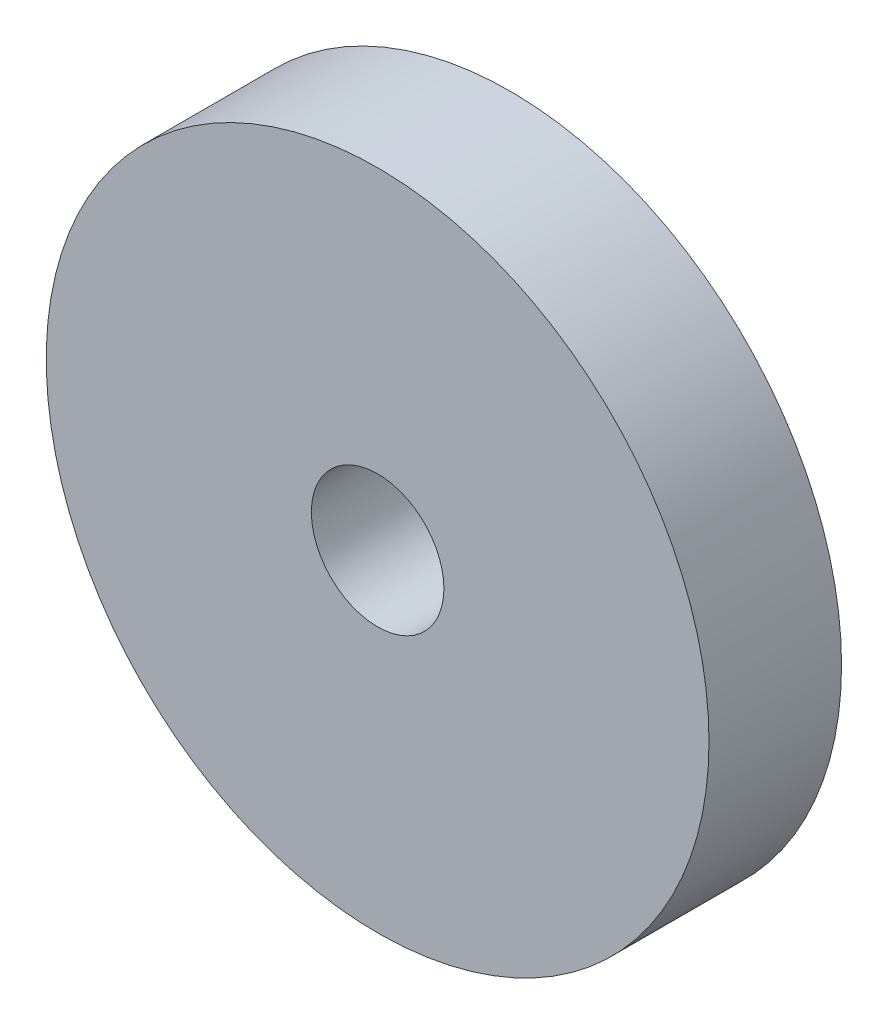
ISO-10303-21;
HEADER;
FILE_DESCRIPTION(('STEP AP214'),'2;1');
FILE_NAME('part.step','',(''),(''),'','','');
FILE_SCHEMA(('AUTOMOTIVE_DESIGN { 1 0 10303 214 1 1 1 1 }'));
ENDSEC;
DATA;
#1=APPLICATION_CONTEXT('core data for automotive mechanical design processes');
#2=APPLICATION_PROTOCOL_DEFINITION('international standard','automotive_design',2000,#1);
#3=PRODUCT_CONTEXT('',#1,'mechanical');
#4=PRODUCT('Part','Part','',(#3));
#5=PRODUCT_RELATED_PRODUCT_CATEGORY('part','',(#4));
#6=PRODUCT_DEFINITION_FORMATION('','',#4);
#7=PRODUCT_DEFINITION_CONTEXT('part definition',#1,'design');
#8=PRODUCT_DEFINITION('design','',#6,#7);
#9=PRODUCT_DEFINITION_SHAPE('','',#8);
#10=(LENGTH_UNIT() NAMED_UNIT(*) SI_UNIT(.MILLI.,.METRE.));
#11=(NAMED_UNIT(*) PLANE_ANGLE_UNIT() SI_UNIT($,.RADIAN.));
#12=(NAMED_UNIT(*) SI_UNIT($,.STERADIAN.) SOLID_ANGLE_UNIT());
#13=UNCERTAINTY_MEASURE_WITH_UNIT(LENGTH_MEASURE(1.E-05),#10,'distance_accuracy_value','');
#14=(GEOMETRIC_REPRESENTATION_CONTEXT(3) GLOBAL_UNCERTAINTY_ASSIGNED_CONTEXT((#13)) GLOBAL_UNIT_ASSIGNED_CONTEXT((#10,
#11,#12)) REPRESENTATION_CONTEXT('',''));
#15=CARTESIAN_POINT('',(0.,0.,0.));
#16=DIRECTION('',(0.,0.,1.));
#17=DIRECTION('',(1.,0.,0.));
#18=AXIS2_PLACEMENT_3D('',#15,#16,#17);
#19=CARTESIAN_POINT('',(0.,0.,20.));
#20=DIRECTION('',(0.,0.,1.));
#21=DIRECTION('',(1.,0.,0.));
#22=AXIS2_PLACEMENT_3D('',#19,#20,#21);
#23=PLANE('',#22);
#24=CARTESIAN_POINT('',(0.,0.,20.));
#25=DIRECTION('',(0.,0.,1.));
#26=DIRECTION('',(1.,0.,0.));
#27=AXIS2_PLACEMENT_3D('',#24,#25,#26);
#28=CIRCLE('',#27,50.);
#29=CARTESIAN_POINT('',(50.,0.,20.));
#30=VERTEX_POINT('',#29);
#31=EDGE_CURVE('E10',#30,#30,#28,.T.);
#32=ORIENTED_EDGE('',*,*,#31,.T.);
#33=EDGE_LOOP('',(#32));
#34=FACE_BOUND('',#33,.T.);
#35=CARTESIAN_POINT('',(0.,0.,20.));
#36=DIRECTION('',(0.,0.,1.));
#37=DIRECTION('',(1.,0.,0.));
#38=AXIS2_PLACEMENT_3D('',#35,#36,#37);
#39=CIRCLE('',#38,10.);
#40=CARTESIAN_POINT('',(10.,0.,20.));
#41=VERTEX_POINT('',#40);
#42=EDGE_CURVE('E54',#41,#41,#39,.T.);
#43=ORIENTED_EDGE('',*,*,#42,.F.);
#44=EDGE_LOOP('',(#43));
#45=FACE_BOUND('',#44,.T.);
#46=ADVANCED_FACE('F41',(#34,#45),#23,.T.);
#47=CARTESIAN_POINT('',(0.,0.,0.));
#48=DIRECTION('',(0.,0.,1.));
#49=DIRECTION('',(1.,0.,0.));
#50=AXIS2_PLACEMENT_3D('',#47,#48,#49);
#51=PLANE('',#50);
#52=CARTESIAN_POINT('',(0.,0.,0.));
#53=DIRECTION('',(0.,0.,1.));
#54=DIRECTION('',(1.,0.,0.));
#55=AXIS2_PLACEMENT_3D('',#52,#53,#54);
#56=CIRCLE('',#55,50.);
#57=CARTESIAN_POINT('',(50.,0.,0.));
#58=VERTEX_POINT('',#57);
#59=EDGE_CURVE('E45',#58,#58,#56,.T.);
#60=ORIENTED_EDGE('',*,*,#59,.F.);
#61=EDGE_LOOP('',(#60));
#62=FACE_BOUND('',#61,.T.);
#63=CARTESIAN_POINT('',(0.,0.,0.));
#64=DIRECTION('',(0.,0.,1.));
#65=DIRECTION('',(1.,0.,0.));
#66=AXIS2_PLACEMENT_3D('',#63,#64,#65);
#67=CIRCLE('',#66,10.);
#68=CARTESIAN_POINT('',(10.,0.,0.));
#69=VERTEX_POINT('',#68);
#70=EDGE_CURVE('E56',#69,#69,#67,.T.);
#71=ORIENTED_EDGE('',*,*,#70,.T.);
#72=EDGE_LOOP('',(#71));
#73=FACE_BOUND('',#72,.T.);
#74=ADVANCED_FACE('F68',(#62,#73),#51,.F.);
#75=CARTESIAN_POINT('',(0.,0.,20.));
#76=DIRECTION('',(0.,0.,-1.));
#77=DIRECTION('',(-1.,0.,0.));
#78=AXIS2_PLACEMENT_3D('',#75,#76,#77);
#79=CYLINDRICAL_SURFACE('',#78,50.);
#80=ORIENTED_EDGE('',*,*,#31,.F.);
#81=EDGE_LOOP('',(#80));
#82=FACE_BOUND('',#81,.T.);
#83=ORIENTED_EDGE('',*,*,#59,.T.);
#84=EDGE_LOOP('',(#83));
#85=FACE_BOUND('',#84,.T.);
#86=ADVANCED_FACE('F43',(#82,#85),#79,.T.);
#87=CARTESIAN_POINT('',(0.,0.,20.));
#88=DIRECTION('',(0.,0.,-1.));
#89=DIRECTION('',(-1.,0.,0.));
#90=AXIS2_PLACEMENT_3D('',#87,#88,#89);
#91=CYLINDRICAL_SURFACE('',#90,10.);
#92=ORIENTED_EDGE('',*,*,#42,.T.);
#93=EDGE_LOOP('',(#92));
#94=FACE_BOUND('',#93,.T.);
#95=ORIENTED_EDGE('',*,*,#70,.F.);
#96=EDGE_LOOP('',(#95));
#97=FACE_BOUND('',#96,.T.);
#98=ADVANCED_FACE('F64',(#94,#97),#91,.F.);
#99=CLOSED_SHELL('',(#46,#74,#86,#98));
#100=MANIFOLD_SOLID_BREP('B2',#99);
#101=ADVANCED_BREP_SHAPE_REPRESENTATION('',(#18,#100),#14);
#102=SHAPE_DEFINITION_REPRESENTATION(#9,#101);
ENDSEC;
END-ISO-10303-21;
